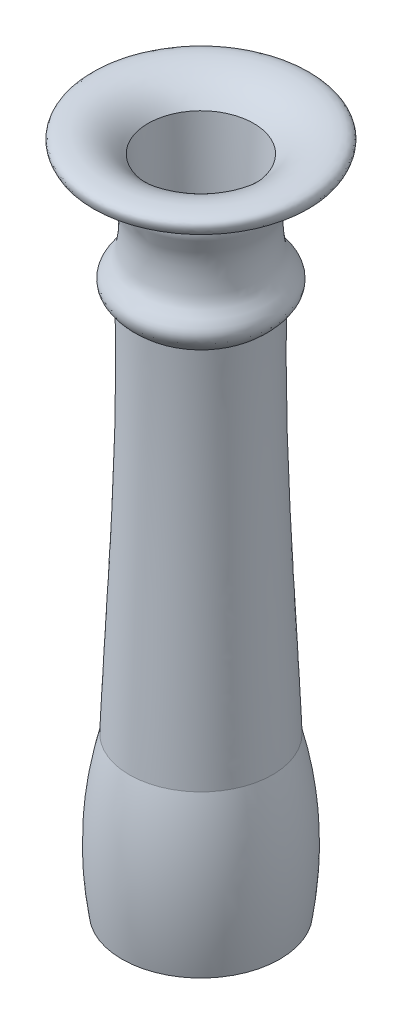
ISO-10303-21;
HEADER;
FILE_DESCRIPTION(('STEP AP214'),'2;1');
FILE_NAME('part.step','',(''),(''),'','','');
FILE_SCHEMA(('AUTOMOTIVE_DESIGN { 1 0 10303 214 1 1 1 1 }'));
ENDSEC;
DATA;
#1=APPLICATION_CONTEXT('core data for automotive mechanical design processes');
#2=APPLICATION_PROTOCOL_DEFINITION('international standard','automotive_design',2000,#1);
#3=PRODUCT_CONTEXT('',#1,'mechanical');
#4=PRODUCT('Part','Part','',(#3));
#5=PRODUCT_RELATED_PRODUCT_CATEGORY('part','',(#4));
#6=PRODUCT_DEFINITION_FORMATION('','',#4);
#7=PRODUCT_DEFINITION_CONTEXT('part definition',#1,'design');
#8=PRODUCT_DEFINITION('design','',#6,#7);
#9=PRODUCT_DEFINITION_SHAPE('','',#8);
#10=(LENGTH_UNIT() NAMED_UNIT(*) SI_UNIT(.MILLI.,.METRE.));
#11=(NAMED_UNIT(*) PLANE_ANGLE_UNIT() SI_UNIT($,.RADIAN.));
#12=(NAMED_UNIT(*) SI_UNIT($,.STERADIAN.) SOLID_ANGLE_UNIT());
#13=UNCERTAINTY_MEASURE_WITH_UNIT(LENGTH_MEASURE(1.E-05),#10,'distance_accuracy_value','');
#14=(GEOMETRIC_REPRESENTATION_CONTEXT(3) GLOBAL_UNCERTAINTY_ASSIGNED_CONTEXT((#13)) GLOBAL_UNIT_ASSIGNED_CONTEXT((#10,
#11,#12)) REPRESENTATION_CONTEXT('',''));
#15=CARTESIAN_POINT('',(0.,0.,0.));
#16=DIRECTION('',(0.,0.,1.));
#17=DIRECTION('',(1.,0.,0.));
#18=AXIS2_PLACEMENT_3D('',#15,#16,#17);
#19=CARTESIAN_POINT('',(117.358224262687,76.3370766583239,0.));
#20=CARTESIAN_POINT('',(117.249684578811,76.1481293340499,0.));
#21=CARTESIAN_POINT('',(117.032605211058,75.7702346855019,0.));
#22=CARTESIAN_POINT('',(116.631904182839,75.941601261265,0.));
#23=CARTESIAN_POINT('',(116.431553668729,76.0272845491466,0.));
#24=B_SPLINE_CURVE_WITH_KNOTS('',3,(#19,#20,#21,#22,#23),.UNSPECIFIED.,.F.,.F.,(4,1,4),(0.,
0.499999999999996,1.),.UNSPECIFIED.);
#25=CARTESIAN_POINT('',(129.64929975665,646.084033560278,0.));
#26=DIRECTION('',(0.,1.,0.));
#27=AXIS1_PLACEMENT('',#25,#26);
#28=SURFACE_OF_REVOLUTION('',#24,#27);
#29=CARTESIAN_POINT('',(129.64929975665,76.0272845491465,0.));
#30=DIRECTION('',(0.,1.,0.));
#31=DIRECTION('',(0.,0.,1.));
#32=AXIS2_PLACEMENT_3D('',#29,#30,#31);
#33=CIRCLE('',#32,13.2177460879212);
#34=CARTESIAN_POINT('',(129.64929975665,76.0272845491465,13.2177460879212));
#35=VERTEX_POINT('',#34);
#36=EDGE_CURVE('E75',#35,#35,#33,.T.);
#37=ORIENTED_EDGE('',*,*,#36,.F.);
#38=EDGE_LOOP('',(#37));
#39=FACE_BOUND('',#38,.T.);
#40=CARTESIAN_POINT('',(129.64929975665,76.3370766583239,0.));
#41=DIRECTION('',(0.,1.,0.));
#42=DIRECTION('',(0.,0.,1.));
#43=AXIS2_PLACEMENT_3D('',#40,#41,#42);
#44=CIRCLE('',#43,12.2910754939633);
#45=CARTESIAN_POINT('',(129.64929975665,76.3370766583239,12.2910754939633));
#46=VERTEX_POINT('',#45);
#47=EDGE_CURVE('E10',#46,#46,#44,.T.);
#48=ORIENTED_EDGE('',*,*,#47,.T.);
#49=EDGE_LOOP('',(#48));
#50=FACE_BOUND('',#49,.T.);
#51=ADVANCED_FACE('F39',(#39,#50),#28,.T.);
#52=CARTESIAN_POINT('',(119.271875414991,103.214273825947,0.));
#53=CARTESIAN_POINT('',(117.151300913177,94.3485469709708,0.));
#54=CARTESIAN_POINT('',(117.927835332769,85.3102043195262,0.));
#55=CARTESIAN_POINT('',(117.358224262687,76.3370766583239,0.));
#56=B_SPLINE_CURVE_WITH_KNOTS('',3,(#52,#53,#54,#55),.UNSPECIFIED.,.F.,.F.,(4,4),(0.,1.),.UNSPECIFIED.);
#57=CARTESIAN_POINT('',(129.64929975665,646.084033560278,0.));
#58=DIRECTION('',(0.,1.,0.));
#59=AXIS1_PLACEMENT('',#57,#58);
#60=SURFACE_OF_REVOLUTION('',#56,#59);
#61=ORIENTED_EDGE('',*,*,#47,.F.);
#62=EDGE_LOOP('',(#61));
#63=FACE_BOUND('',#62,.T.);
#64=CARTESIAN_POINT('',(129.64929975665,103.214273825947,0.));
#65=DIRECTION('',(0.,1.,0.));
#66=DIRECTION('',(0.,0.,1.));
#67=AXIS2_PLACEMENT_3D('',#64,#65,#66);
#68=CIRCLE('',#67,10.3774243416595);
#69=CARTESIAN_POINT('',(129.64929975665,103.214273825947,10.3774243416595));
#70=VERTEX_POINT('',#69);
#71=EDGE_CURVE('E47',#70,#70,#68,.T.);
#72=ORIENTED_EDGE('',*,*,#71,.T.);
#73=EDGE_LOOP('',(#72));
#74=FACE_BOUND('',#73,.T.);
#75=ADVANCED_FACE('F129',(#63,#74),#60,.T.);
#76=CARTESIAN_POINT('',(120.806385550323,186.163339170325,0.));
#77=CARTESIAN_POINT('',(122.873508694379,158.555924054164,0.));
#78=CARTESIAN_POINT('',(121.324602675737,130.76241205279,0.));
#79=CARTESIAN_POINT('',(119.271875414991,103.214273825947,0.));
#80=B_SPLINE_CURVE_WITH_KNOTS('',3,(#76,#77,#78,#79),.UNSPECIFIED.,.F.,.F.,(4,4),(0.,1.),.UNSPECIFIED.);
#81=CARTESIAN_POINT('',(129.64929975665,646.084033560278,0.));
#82=DIRECTION('',(0.,1.,0.));
#83=AXIS1_PLACEMENT('',#81,#82);
#84=SURFACE_OF_REVOLUTION('',#80,#83);
#85=ORIENTED_EDGE('',*,*,#71,.F.);
#86=EDGE_LOOP('',(#85));
#87=FACE_BOUND('',#86,.T.);
#88=CARTESIAN_POINT('',(129.64929975665,186.163339170325,0.));
#89=DIRECTION('',(0.,1.,0.));
#90=DIRECTION('',(0.,0.,1.));
#91=AXIS2_PLACEMENT_3D('',#88,#89,#90);
#92=CIRCLE('',#91,8.84291420632698);
#93=CARTESIAN_POINT('',(129.64929975665,186.163339170325,8.84291420632698));
#94=VERTEX_POINT('',#93);
#95=EDGE_CURVE('E52',#94,#94,#92,.T.);
#96=ORIENTED_EDGE('',*,*,#95,.T.);
#97=EDGE_LOOP('',(#96));
#98=FACE_BOUND('',#97,.T.);
#99=ADVANCED_FACE('F126',(#87,#98),#84,.T.);
#100=CARTESIAN_POINT('',(111.663870506161,187.17686302536,0.));
#101=CARTESIAN_POINT('',(110.590299705573,189.087622659832,0.));
#102=CARTESIAN_POINT('',(115.389578126019,190.38411732323,0.));
#103=CARTESIAN_POINT('',(118.950124397196,188.372913673894,0.));
#104=CARTESIAN_POINT('',(120.806385550323,186.163339170325,0.));
#105=B_SPLINE_CURVE_WITH_KNOTS('',3,(#100,#101,#102,#103,#104),.UNSPECIFIED.,.F.,.F.,(4,1,4),
(0.,0.311759072739206,1.),.UNSPECIFIED.);
#106=CARTESIAN_POINT('',(129.64929975665,646.084033560278,0.));
#107=DIRECTION('',(0.,1.,0.));
#108=AXIS1_PLACEMENT('',#106,#107);
#109=SURFACE_OF_REVOLUTION('',#105,#108);
#110=ORIENTED_EDGE('',*,*,#95,.F.);
#111=EDGE_LOOP('',(#110));
#112=FACE_BOUND('',#111,.T.);
#113=CARTESIAN_POINT('',(129.64929975665,187.17686302536,0.));
#114=DIRECTION('',(0.,1.,0.));
#115=DIRECTION('',(0.,0.,1.));
#116=AXIS2_PLACEMENT_3D('',#113,#114,#115);
#117=CIRCLE('',#116,17.9854292504896);
#118=CARTESIAN_POINT('',(129.64929975665,187.17686302536,17.9854292504896));
#119=VERTEX_POINT('',#118);
#120=EDGE_CURVE('E57',#119,#119,#117,.T.);
#121=ORIENTED_EDGE('',*,*,#120,.T.);
#122=EDGE_LOOP('',(#121));
#123=FACE_BOUND('',#122,.T.);
#124=ADVANCED_FACE('F123',(#112,#123),#109,.T.);
#125=CARTESIAN_POINT('',(129.64929975665,183.176128872314,0.));
#126=DIRECTION('',(0.,1.,0.));
#127=DIRECTION('',(0.,0.,1.));
#128=AXIS2_PLACEMENT_3D('',#125,#126,#127);
#129=CONICAL_SURFACE('',#128,10.7809793616107,1.06388218568661);
#130=ORIENTED_EDGE('',*,*,#120,.F.);
#131=EDGE_LOOP('',(#130));
#132=FACE_BOUND('',#131,.T.);
#133=CARTESIAN_POINT('',(129.64929975665,183.176128872314,0.));
#134=DIRECTION('',(0.,1.,0.));
#135=DIRECTION('',(0.,0.,1.));
#136=AXIS2_PLACEMENT_3D('',#133,#134,#135);
#137=CIRCLE('',#136,10.7809793616107);
#138=CARTESIAN_POINT('',(129.64929975665,183.176128872314,10.7809793616107));
#139=VERTEX_POINT('',#138);
#140=EDGE_CURVE('E63',#139,#139,#137,.T.);
#141=ORIENTED_EDGE('',*,*,#140,.T.);
#142=EDGE_LOOP('',(#141));
#143=FACE_BOUND('',#142,.T.);
#144=ADVANCED_FACE('F102',(#132,#143),#129,.T.);
#145=CARTESIAN_POINT('',(119.442207240602,164.953243153261,0.));
#146=CARTESIAN_POINT('',(115.326253979268,168.344251254593,0.));
#147=CARTESIAN_POINT('',(119.108135767244,169.859814889074,0.));
#148=CARTESIAN_POINT('',(120.001165822523,174.829445021614,0.));
#149=CARTESIAN_POINT('',(120.101813551699,178.912569184401,0.));
#150=CARTESIAN_POINT('',(118.246401498073,181.881826393312,0.));
#151=CARTESIAN_POINT('',(118.868320395034,183.176128872314,0.));
#152=B_SPLINE_CURVE_WITH_KNOTS('',3,(#145,#146,#147,#148,#149,#150,#151),.UNSPECIFIED.,.F.,.F.,
(4,1,1,1,4),(0.,0.36339236515462,0.469725943414408,0.799682305851081,1.),.UNSPECIFIED.);
#153=CARTESIAN_POINT('',(129.64929975665,646.084033560278,0.));
#154=DIRECTION('',(0.,1.,0.));
#155=AXIS1_PLACEMENT('',#153,#154);
#156=SURFACE_OF_REVOLUTION('',#152,#155);
#157=ORIENTED_EDGE('',*,*,#140,.F.);
#158=EDGE_LOOP('',(#157));
#159=FACE_BOUND('',#158,.T.);
#160=CARTESIAN_POINT('',(129.64929975665,164.953243153261,0.));
#161=DIRECTION('',(0.,1.,0.));
#162=DIRECTION('',(0.,0.,1.));
#163=AXIS2_PLACEMENT_3D('',#160,#161,#162);
#164=CIRCLE('',#163,10.2070925160485);
#165=CARTESIAN_POINT('',(129.64929975665,164.953243153261,10.2070925160485));
#166=VERTEX_POINT('',#165);
#167=EDGE_CURVE('E67',#166,#166,#164,.T.);
#168=ORIENTED_EDGE('',*,*,#167,.T.);
#169=EDGE_LOOP('',(#168));
#170=FACE_BOUND('',#169,.T.);
#171=ADVANCED_FACE('F98',(#159,#170),#156,.T.);
#172=CARTESIAN_POINT('',(117.667460935684,102.135154689869,0.));
#173=CARTESIAN_POINT('',(118.476862906649,123.064758110648,0.));
#174=CARTESIAN_POINT('',(119.951785106893,143.992589497044,0.));
#175=CARTESIAN_POINT('',(119.442207240602,164.953243153261,0.));
#176=B_SPLINE_CURVE_WITH_KNOTS('',3,(#172,#173,#174,#175),.UNSPECIFIED.,.F.,.F.,(4,4),(0.,1.),.UNSPECIFIED.);
#177=CARTESIAN_POINT('',(129.64929975665,646.084033560278,0.));
#178=DIRECTION('',(0.,1.,0.));
#179=AXIS1_PLACEMENT('',#177,#178);
#180=SURFACE_OF_REVOLUTION('',#176,#179);
#181=ORIENTED_EDGE('',*,*,#167,.F.);
#182=EDGE_LOOP('',(#181));
#183=FACE_BOUND('',#182,.T.);
#184=CARTESIAN_POINT('',(129.64929975665,102.135154689869,0.));
#185=DIRECTION('',(0.,1.,0.));
#186=DIRECTION('',(0.,0.,1.));
#187=AXIS2_PLACEMENT_3D('',#184,#185,#186);
#188=CIRCLE('',#187,11.9818388209657);
#189=CARTESIAN_POINT('',(129.64929975665,102.135154689869,11.9818388209657));
#190=VERTEX_POINT('',#189);
#191=EDGE_CURVE('E71',#190,#190,#188,.T.);
#192=ORIENTED_EDGE('',*,*,#191,.T.);
#193=EDGE_LOOP('',(#192));
#194=FACE_BOUND('',#193,.T.);
#195=ADVANCED_FACE('F94',(#183,#194),#180,.T.);
#196=CARTESIAN_POINT('',(116.431553668729,76.0272845491466,0.));
#197=CARTESIAN_POINT('',(114.31515966035,89.2184046864966,0.));
#198=CARTESIAN_POINT('',(117.667460935684,102.135154689869,0.));
#199=B_SPLINE_CURVE_WITH_KNOTS('',2,(#196,#197,#198),.UNSPECIFIED.,.F.,.F.,(3,3),(0.,1.),.UNSPECIFIED.);
#200=CARTESIAN_POINT('',(129.64929975665,646.084033560278,0.));
#201=DIRECTION('',(0.,1.,0.));
#202=AXIS1_PLACEMENT('',#200,#201);
#203=SURFACE_OF_REVOLUTION('',#199,#202);
#204=ORIENTED_EDGE('',*,*,#191,.F.);
#205=EDGE_LOOP('',(#204));
#206=FACE_BOUND('',#205,.T.);
#207=ORIENTED_EDGE('',*,*,#36,.T.);
#208=EDGE_LOOP('',(#207));
#209=FACE_BOUND('',#208,.T.);
#210=ADVANCED_FACE('F91',(#206,#209),#203,.T.);
#211=CLOSED_SHELL('',(#51,#75,#99,#124,#144,#171,#195,#210));
#212=MANIFOLD_SOLID_BREP('B2',#211);
#213=ADVANCED_BREP_SHAPE_REPRESENTATION('',(#18,#212),#14);
#214=SHAPE_DEFINITION_REPRESENTATION(#9,#213);
ENDSEC;
END-ISO-10303-21;
